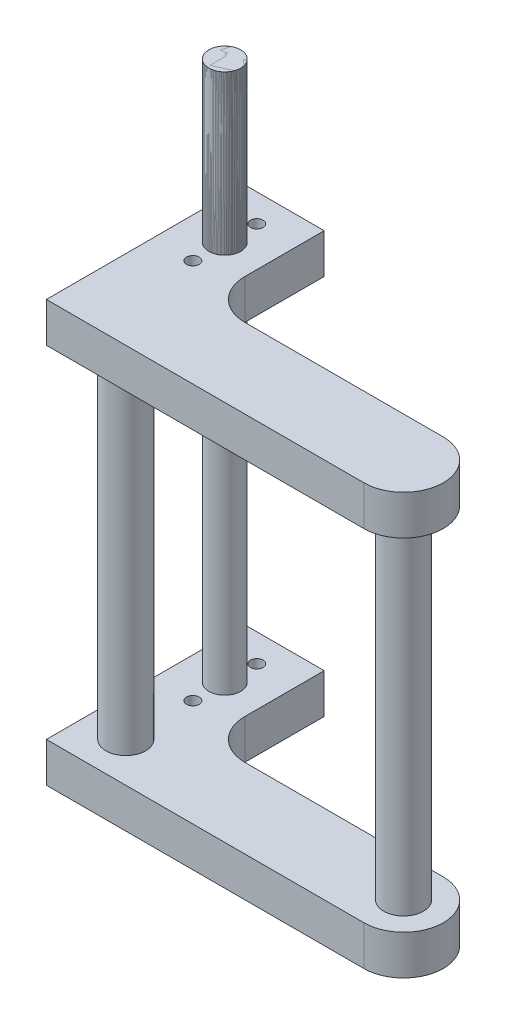
ISO-10303-21;
HEADER;
FILE_DESCRIPTION(('STEP AP214'),'2;1');
FILE_NAME('part.step','',(''),(''),'','','');
FILE_SCHEMA(('AUTOMOTIVE_DESIGN { 1 0 10303 214 1 1 1 1 }'));
ENDSEC;
DATA;
#1=APPLICATION_CONTEXT('core data for automotive mechanical design processes');
#2=APPLICATION_PROTOCOL_DEFINITION('international standard','automotive_design',2000,#1);
#3=PRODUCT_CONTEXT('',#1,'mechanical');
#4=PRODUCT('Part','Part','',(#3));
#5=PRODUCT_RELATED_PRODUCT_CATEGORY('part','',(#4));
#6=PRODUCT_DEFINITION_FORMATION('','',#4);
#7=PRODUCT_DEFINITION_CONTEXT('part definition',#1,'design');
#8=PRODUCT_DEFINITION('design','',#6,#7);
#9=PRODUCT_DEFINITION_SHAPE('','',#8);
#10=(LENGTH_UNIT() NAMED_UNIT(*) SI_UNIT(.MILLI.,.METRE.));
#11=(NAMED_UNIT(*) PLANE_ANGLE_UNIT() SI_UNIT($,.RADIAN.));
#12=(NAMED_UNIT(*) SI_UNIT($,.STERADIAN.) SOLID_ANGLE_UNIT());
#13=UNCERTAINTY_MEASURE_WITH_UNIT(LENGTH_MEASURE(1.E-05),#10,'distance_accuracy_value','');
#14=(GEOMETRIC_REPRESENTATION_CONTEXT(3) GLOBAL_UNCERTAINTY_ASSIGNED_CONTEXT((#13)) GLOBAL_UNIT_ASSIGNED_CONTEXT((#10,
#11,#12)) REPRESENTATION_CONTEXT('',''));
#15=CARTESIAN_POINT('',(0.,0.,0.));
#16=DIRECTION('',(0.,0.,1.));
#17=DIRECTION('',(1.,0.,0.));
#18=AXIS2_PLACEMENT_3D('',#15,#16,#17);
#19=CARTESIAN_POINT('',(0.,106.,0.));
#20=DIRECTION('',(0.,1.,0.));
#21=DIRECTION('',(0.,0.,1.));
#22=AXIS2_PLACEMENT_3D('',#19,#20,#21);
#23=PLANE('',#22);
#24=CARTESIAN_POINT('',(-10.,106.,-14.95));
#25=DIRECTION('',(0.,1.,0.));
#26=DIRECTION('',(0.,0.,1.));
#27=AXIS2_PLACEMENT_3D('',#24,#25,#26);
#28=CIRCLE('',#27,4.);
#29=CARTESIAN_POINT('',(-10.,106.,-10.95));
#30=VERTEX_POINT('',#29);
#31=EDGE_CURVE('E62',#30,#30,#28,.T.);
#32=ORIENTED_EDGE('',*,*,#31,.F.);
#33=EDGE_LOOP('',(#32));
#34=FACE_BOUND('',#33,.T.);
#35=ADVANCED_FACE('F58',(#34),#23,.F.);
#36=CARTESIAN_POINT('',(-10.,146.,-14.95));
#37=DIRECTION('',(0.,-1.,0.));
#38=DIRECTION('',(0.,0.,-1.));
#39=AXIS2_PLACEMENT_3D('',#36,#37,#38);
#40=CYLINDRICAL_SURFACE('',#39,4.);
#41=CARTESIAN_POINT('',(-10.,146.,-14.95));
#42=DIRECTION('',(0.,1.,0.));
#43=DIRECTION('',(0.,0.,1.));
#44=AXIS2_PLACEMENT_3D('',#41,#42,#43);
#45=CIRCLE('',#44,4.);
#46=CARTESIAN_POINT('',(-10.,146.,-10.95));
#47=VERTEX_POINT('',#46);
#48=EDGE_CURVE('E12',#47,#47,#45,.T.);
#49=ORIENTED_EDGE('',*,*,#48,.F.);
#50=EDGE_LOOP('',(#49));
#51=FACE_BOUND('',#50,.T.);
#52=ORIENTED_EDGE('',*,*,#31,.T.);
#53=EDGE_LOOP('',(#52));
#54=FACE_BOUND('',#53,.T.);
#55=ADVANCED_FACE('F60',(#51,#54),#40,.T.);
#56=CARTESIAN_POINT('',(0.,146.,0.));
#57=DIRECTION('',(0.,1.,0.));
#58=DIRECTION('',(0.,0.,1.));
#59=AXIS2_PLACEMENT_3D('',#56,#57,#58);
#60=PLANE('',#59);
#61=ORIENTED_EDGE('',*,*,#48,.T.);
#62=EDGE_LOOP('',(#61));
#63=FACE_BOUND('',#62,.T.);
#64=ADVANCED_FACE('F73',(#63),#60,.T.);
#65=CLOSED_SHELL('',(#35,#55,#64));
#66=MANIFOLD_SOLID_BREP('B2',#65);
#67=CARTESIAN_POINT('',(-10.,106.,10.));
#68=DIRECTION('',(0.,-1.,0.));
#69=DIRECTION('',(0.,0.,-1.));
#70=AXIS2_PLACEMENT_3D('',#67,#68,#69);
#71=CYLINDRICAL_SURFACE('',#70,5.);
#72=CARTESIAN_POINT('',(-10.,9.99999999999999,10.));
#73=DIRECTION('',(0.,-1.,0.));
#74=DIRECTION('',(0.,0.,-1.));
#75=AXIS2_PLACEMENT_3D('',#72,#73,#74);
#76=CIRCLE('',#75,5.);
#77=CARTESIAN_POINT('',(-10.,9.99999999999999,5.));
#78=VERTEX_POINT('',#77);
#79=EDGE_CURVE('E222',#78,#78,#76,.T.);
#80=ORIENTED_EDGE('',*,*,#79,.F.);
#81=EDGE_LOOP('',(#80));
#82=FACE_BOUND('',#81,.T.);
#83=CARTESIAN_POINT('',(-10.,96.,10.));
#84=DIRECTION('',(0.,-1.,0.));
#85=DIRECTION('',(0.,0.,-1.));
#86=AXIS2_PLACEMENT_3D('',#83,#84,#85);
#87=CIRCLE('',#86,5.);
#88=CARTESIAN_POINT('',(-10.,96.,5.));
#89=VERTEX_POINT('',#88);
#90=EDGE_CURVE('E645',#89,#89,#87,.T.);
#91=ORIENTED_EDGE('',*,*,#90,.T.);
#92=EDGE_LOOP('',(#91));
#93=FACE_BOUND('',#92,.T.);
#94=ADVANCED_FACE('F108',(#82,#93),#71,.T.);
#95=CARTESIAN_POINT('',(-10.,106.,-14.95));
#96=DIRECTION('',(0.,-1.,0.));
#97=DIRECTION('',(0.,0.,-1.));
#98=AXIS2_PLACEMENT_3D('',#95,#96,#97);
#99=CYLINDRICAL_SURFACE('',#98,4.);
#100=CARTESIAN_POINT('',(-10.,9.99999999999999,-14.95));
#101=DIRECTION('',(0.,-1.,0.));
#102=DIRECTION('',(0.,0.,-1.));
#103=AXIS2_PLACEMENT_3D('',#100,#101,#102);
#104=CIRCLE('',#103,4.);
#105=CARTESIAN_POINT('',(-10.,9.99999999999999,-18.95));
#106=VERTEX_POINT('',#105);
#107=EDGE_CURVE('E265',#106,#106,#104,.T.);
#108=ORIENTED_EDGE('',*,*,#107,.F.);
#109=EDGE_LOOP('',(#108));
#110=FACE_BOUND('',#109,.T.);
#111=CARTESIAN_POINT('',(-10.,96.,-14.95));
#112=DIRECTION('',(0.,-1.,0.));
#113=DIRECTION('',(0.,0.,-1.));
#114=AXIS2_PLACEMENT_3D('',#111,#112,#113);
#115=CIRCLE('',#114,4.);
#116=CARTESIAN_POINT('',(-10.,96.,-18.95));
#117=VERTEX_POINT('',#116);
#118=EDGE_CURVE('E642',#117,#117,#115,.T.);
#119=ORIENTED_EDGE('',*,*,#118,.T.);
#120=EDGE_LOOP('',(#119));
#121=FACE_BOUND('',#120,.T.);
#122=ADVANCED_FACE('F389',(#110,#121),#99,.T.);
#123=CARTESIAN_POINT('',(60.,106.,10.));
#124=DIRECTION('',(0.,-1.,0.));
#125=DIRECTION('',(0.,0.,-1.));
#126=AXIS2_PLACEMENT_3D('',#123,#124,#125);
#127=CYLINDRICAL_SURFACE('',#126,5.);
#128=CARTESIAN_POINT('',(60.,9.99999999999999,10.));
#129=DIRECTION('',(0.,-1.,0.));
#130=DIRECTION('',(0.,0.,-1.));
#131=AXIS2_PLACEMENT_3D('',#128,#129,#130);
#132=CIRCLE('',#131,5.);
#133=CARTESIAN_POINT('',(60.,9.99999999999999,5.));
#134=VERTEX_POINT('',#133);
#135=EDGE_CURVE('E268',#134,#134,#132,.T.);
#136=ORIENTED_EDGE('',*,*,#135,.F.);
#137=EDGE_LOOP('',(#136));
#138=FACE_BOUND('',#137,.T.);
#139=CARTESIAN_POINT('',(60.,96.,10.));
#140=DIRECTION('',(0.,-1.,0.));
#141=DIRECTION('',(0.,0.,-1.));
#142=AXIS2_PLACEMENT_3D('',#139,#140,#141);
#143=CIRCLE('',#142,5.);
#144=CARTESIAN_POINT('',(60.,96.,5.));
#145=VERTEX_POINT('',#144);
#146=EDGE_CURVE('E637',#145,#145,#143,.T.);
#147=ORIENTED_EDGE('',*,*,#146,.T.);
#148=EDGE_LOOP('',(#147));
#149=FACE_BOUND('',#148,.T.);
#150=ADVANCED_FACE('F396',(#138,#149),#127,.T.);
#151=CARTESIAN_POINT('',(60.,10.,10.));
#152=DIRECTION('',(0.,-1.,0.));
#153=DIRECTION('',(0.,0.,-1.));
#154=AXIS2_PLACEMENT_3D('',#151,#152,#153);
#155=PLANE('',#154);
#156=ORIENTED_EDGE('',*,*,#135,.T.);
#157=EDGE_LOOP('',(#156));
#158=FACE_BOUND('',#157,.T.);
#159=ORIENTED_EDGE('',*,*,#107,.T.);
#160=EDGE_LOOP('',(#159));
#161=FACE_BOUND('',#160,.T.);
#162=ORIENTED_EDGE('',*,*,#79,.T.);
#163=EDGE_LOOP('',(#162));
#164=FACE_BOUND('',#163,.T.);
#165=DIRECTION('',(-1.,0.,0.));
#166=VECTOR('',#165,1.);
#167=CARTESIAN_POINT('',(0.,10.,0.));
#168=LINE('',#167,#166);
#169=CARTESIAN_POINT('',(60.,10.,0.));
#170=VERTEX_POINT('',#169);
#171=CARTESIAN_POINT('',(10.,10.,0.));
#172=VERTEX_POINT('',#171);
#173=EDGE_CURVE('E284',#170,#172,#168,.T.);
#174=ORIENTED_EDGE('',*,*,#173,.T.);
#175=CARTESIAN_POINT('',(10.,10.,-10.));
#176=DIRECTION('',(0.,-1.,0.));
#177=DIRECTION('',(0.,0.,-1.));
#178=AXIS2_PLACEMENT_3D('',#175,#176,#177);
#179=CIRCLE('',#178,10.);
#180=CARTESIAN_POINT('',(0.,10.,-10.));
#181=VERTEX_POINT('',#180);
#182=EDGE_CURVE('E338',#172,#181,#179,.T.);
#183=ORIENTED_EDGE('',*,*,#182,.T.);
#184=DIRECTION('',(0.,0.,-1.));
#185=VECTOR('',#184,1.);
#186=CARTESIAN_POINT('',(0.,10.,0.));
#187=LINE('',#186,#185);
#188=CARTESIAN_POINT('',(0.,10.,-30.));
#189=VERTEX_POINT('',#188);
#190=EDGE_CURVE('E287',#181,#189,#187,.T.);
#191=ORIENTED_EDGE('',*,*,#190,.T.);
#192=DIRECTION('',(-1.,0.,0.));
#193=VECTOR('',#192,1.);
#194=CARTESIAN_POINT('',(0.,10.,-30.));
#195=LINE('',#194,#193);
#196=CARTESIAN_POINT('',(-20.,10.,-30.));
#197=VERTEX_POINT('',#196);
#198=EDGE_CURVE('E290',#189,#197,#195,.T.);
#199=ORIENTED_EDGE('',*,*,#198,.T.);
#200=DIRECTION('',(0.,0.,1.));
#201=VECTOR('',#200,1.);
#202=CARTESIAN_POINT('',(-20.,10.,-30.));
#203=LINE('',#202,#201);
#204=CARTESIAN_POINT('',(-20.,10.,20.));
#205=VERTEX_POINT('',#204);
#206=EDGE_CURVE('E292',#197,#205,#203,.T.);
#207=ORIENTED_EDGE('',*,*,#206,.T.);
#208=DIRECTION('',(1.,0.,0.));
#209=VECTOR('',#208,1.);
#210=CARTESIAN_POINT('',(-20.,10.,20.));
#211=LINE('',#210,#209);
#212=CARTESIAN_POINT('',(60.,10.,20.));
#213=VERTEX_POINT('',#212);
#214=EDGE_CURVE('E294',#205,#213,#211,.T.);
#215=ORIENTED_EDGE('',*,*,#214,.T.);
#216=CARTESIAN_POINT('',(60.,10.,10.));
#217=DIRECTION('',(0.,1.,0.));
#218=DIRECTION('',(0.,0.,-1.));
#219=AXIS2_PLACEMENT_3D('',#216,#217,#218);
#220=CIRCLE('',#219,10.);
#221=EDGE_CURVE('E296',#213,#170,#220,.T.);
#222=ORIENTED_EDGE('',*,*,#221,.T.);
#223=EDGE_LOOP('',(#174,#183,#191,#199,#207,#215,#222));
#224=FACE_BOUND('',#223,.T.);
#225=CARTESIAN_POINT('',(-10.,10.,-23.));
#226=DIRECTION('',(0.,1.,0.));
#227=DIRECTION('',(0.,0.,1.));
#228=AXIS2_PLACEMENT_3D('',#225,#226,#227);
#229=CIRCLE('',#228,1.6);
#230=CARTESIAN_POINT('',(-10.,10.,-21.4));
#231=VERTEX_POINT('',#230);
#232=EDGE_CURVE('E278',#231,#231,#229,.T.);
#233=ORIENTED_EDGE('',*,*,#232,.F.);
#234=EDGE_LOOP('',(#233));
#235=FACE_BOUND('',#234,.T.);
#236=CARTESIAN_POINT('',(-10.,10.,-6.9));
#237=DIRECTION('',(0.,1.,0.));
#238=DIRECTION('',(0.,0.,1.));
#239=AXIS2_PLACEMENT_3D('',#236,#237,#238);
#240=CIRCLE('',#239,1.6);
#241=CARTESIAN_POINT('',(-10.,10.,-5.29999999999999));
#242=VERTEX_POINT('',#241);
#243=EDGE_CURVE('E272',#242,#242,#240,.T.);
#244=ORIENTED_EDGE('',*,*,#243,.F.);
#245=EDGE_LOOP('',(#244));
#246=FACE_BOUND('',#245,.T.);
#247=ADVANCED_FACE('F342',(#158,#161,#164,#224,#235,#246),#155,.F.);
#248=CARTESIAN_POINT('',(60.,0.,10.));
#249=DIRECTION('',(0.,-1.,0.));
#250=DIRECTION('',(0.,0.,-1.));
#251=AXIS2_PLACEMENT_3D('',#248,#249,#250);
#252=PLANE('',#251);
#253=CARTESIAN_POINT('',(-10.,0.,-23.));
#254=DIRECTION('',(0.,1.,0.));
#255=DIRECTION('',(0.,0.,1.));
#256=AXIS2_PLACEMENT_3D('',#253,#254,#255);
#257=CIRCLE('',#256,1.6);
#258=CARTESIAN_POINT('',(-10.,0.,-21.4));
#259=VERTEX_POINT('',#258);
#260=EDGE_CURVE('E275',#259,#259,#257,.T.);
#261=ORIENTED_EDGE('',*,*,#260,.T.);
#262=EDGE_LOOP('',(#261));
#263=FACE_BOUND('',#262,.T.);
#264=DIRECTION('',(-1.,0.,0.));
#265=VECTOR('',#264,1.);
#266=CARTESIAN_POINT('',(0.,0.,0.));
#267=LINE('',#266,#265);
#268=CARTESIAN_POINT('',(60.,0.,0.));
#269=VERTEX_POINT('',#268);
#270=CARTESIAN_POINT('',(10.,0.,0.));
#271=VERTEX_POINT('',#270);
#272=EDGE_CURVE('E281',#269,#271,#267,.T.);
#273=ORIENTED_EDGE('',*,*,#272,.F.);
#274=CARTESIAN_POINT('',(60.,0.,10.));
#275=DIRECTION('',(0.,1.,0.));
#276=DIRECTION('',(0.,0.,-1.));
#277=AXIS2_PLACEMENT_3D('',#274,#275,#276);
#278=CIRCLE('',#277,10.);
#279=CARTESIAN_POINT('',(60.,0.,20.));
#280=VERTEX_POINT('',#279);
#281=EDGE_CURVE('E288',#280,#269,#278,.T.);
#282=ORIENTED_EDGE('',*,*,#281,.F.);
#283=DIRECTION('',(1.,0.,0.));
#284=VECTOR('',#283,1.);
#285=CARTESIAN_POINT('',(-20.,0.,20.));
#286=LINE('',#285,#284);
#287=CARTESIAN_POINT('',(-20.,0.,20.));
#288=VERTEX_POINT('',#287);
#289=EDGE_CURVE('E307',#288,#280,#286,.T.);
#290=ORIENTED_EDGE('',*,*,#289,.F.);
#291=DIRECTION('',(0.,0.,1.));
#292=VECTOR('',#291,1.);
#293=CARTESIAN_POINT('',(-20.,0.,-30.));
#294=LINE('',#293,#292);
#295=CARTESIAN_POINT('',(-20.,0.,-30.));
#296=VERTEX_POINT('',#295);
#297=EDGE_CURVE('E305',#296,#288,#294,.T.);
#298=ORIENTED_EDGE('',*,*,#297,.F.);
#299=DIRECTION('',(-1.,0.,0.));
#300=VECTOR('',#299,1.);
#301=CARTESIAN_POINT('',(0.,0.,-30.));
#302=LINE('',#301,#300);
#303=CARTESIAN_POINT('',(0.,0.,-30.));
#304=VERTEX_POINT('',#303);
#305=EDGE_CURVE('E303',#304,#296,#302,.T.);
#306=ORIENTED_EDGE('',*,*,#305,.F.);
#307=DIRECTION('',(0.,0.,-1.));
#308=VECTOR('',#307,1.);
#309=CARTESIAN_POINT('',(0.,0.,0.));
#310=LINE('',#309,#308);
#311=CARTESIAN_POINT('',(0.,0.,-10.));
#312=VERTEX_POINT('',#311);
#313=EDGE_CURVE('E301',#312,#304,#310,.T.);
#314=ORIENTED_EDGE('',*,*,#313,.F.);
#315=CARTESIAN_POINT('',(10.,0.,-10.));
#316=DIRECTION('',(0.,-1.,0.));
#317=DIRECTION('',(0.,0.,-1.));
#318=AXIS2_PLACEMENT_3D('',#315,#316,#317);
#319=CIRCLE('',#318,10.);
#320=EDGE_CURVE('E336',#312,#271,#319,.F.);
#321=ORIENTED_EDGE('',*,*,#320,.T.);
#322=EDGE_LOOP('',(#273,#282,#290,#298,#306,#314,#321));
#323=FACE_BOUND('',#322,.T.);
#324=CARTESIAN_POINT('',(-10.,0.,-6.9));
#325=DIRECTION('',(0.,1.,0.));
#326=DIRECTION('',(0.,0.,1.));
#327=AXIS2_PLACEMENT_3D('',#324,#325,#326);
#328=CIRCLE('',#327,1.6);
#329=CARTESIAN_POINT('',(-10.,0.,-5.29999999999999));
#330=VERTEX_POINT('',#329);
#331=EDGE_CURVE('E271',#330,#330,#328,.T.);
#332=ORIENTED_EDGE('',*,*,#331,.T.);
#333=EDGE_LOOP('',(#332));
#334=FACE_BOUND('',#333,.T.);
#335=ADVANCED_FACE('F356',(#263,#323,#334),#252,.T.);
#336=CARTESIAN_POINT('',(0.,10.,0.));
#337=DIRECTION('',(0.,0.,1.));
#338=DIRECTION('',(1.,0.,0.));
#339=AXIS2_PLACEMENT_3D('',#336,#337,#338);
#340=PLANE('',#339);
#341=ORIENTED_EDGE('',*,*,#272,.T.);
#342=DIRECTION('',(0.,-1.,0.));
#343=VECTOR('',#342,1.);
#344=CARTESIAN_POINT('',(10.,10.,0.));
#345=LINE('',#344,#343);
#346=EDGE_CURVE('E330',#271,#172,#345,.F.);
#347=ORIENTED_EDGE('',*,*,#346,.T.);
#348=ORIENTED_EDGE('',*,*,#173,.F.);
#349=DIRECTION('',(0.,-1.,0.));
#350=VECTOR('',#349,1.);
#351=CARTESIAN_POINT('',(60.,10.,0.));
#352=LINE('',#351,#350);
#353=EDGE_CURVE('E298',#170,#269,#352,.T.);
#354=ORIENTED_EDGE('',*,*,#353,.T.);
#355=EDGE_LOOP('',(#341,#347,#348,#354));
#356=FACE_BOUND('',#355,.T.);
#357=ADVANCED_FACE('F361',(#356),#340,.F.);
#358=CARTESIAN_POINT('',(0.,10.,0.));
#359=DIRECTION('',(-1.,0.,0.));
#360=DIRECTION('',(0.,0.,1.));
#361=AXIS2_PLACEMENT_3D('',#358,#359,#360);
#362=PLANE('',#361);
#363=ORIENTED_EDGE('',*,*,#190,.F.);
#364=DIRECTION('',(0.,-1.,0.));
#365=VECTOR('',#364,1.);
#366=CARTESIAN_POINT('',(0.,0.,-10.));
#367=LINE('',#366,#365);
#368=EDGE_CURVE('E327',#181,#312,#367,.T.);
#369=ORIENTED_EDGE('',*,*,#368,.T.);
#370=ORIENTED_EDGE('',*,*,#313,.T.);
#371=DIRECTION('',(0.,-1.,0.));
#372=VECTOR('',#371,1.);
#373=CARTESIAN_POINT('',(0.,10.,-30.));
#374=LINE('',#373,#372);
#375=EDGE_CURVE('E321',#189,#304,#374,.T.);
#376=ORIENTED_EDGE('',*,*,#375,.F.);
#377=EDGE_LOOP('',(#363,#369,#370,#376));
#378=FACE_BOUND('',#377,.T.);
#379=ADVANCED_FACE('F350',(#378),#362,.F.);
#380=CARTESIAN_POINT('',(0.,10.,-30.));
#381=DIRECTION('',(0.,0.,1.));
#382=DIRECTION('',(1.,0.,0.));
#383=AXIS2_PLACEMENT_3D('',#380,#381,#382);
#384=PLANE('',#383);
#385=ORIENTED_EDGE('',*,*,#305,.T.);
#386=DIRECTION('',(0.,-1.,0.));
#387=VECTOR('',#386,1.);
#388=CARTESIAN_POINT('',(-20.,10.,-30.));
#389=LINE('',#388,#387);
#390=EDGE_CURVE('E318',#197,#296,#389,.T.);
#391=ORIENTED_EDGE('',*,*,#390,.F.);
#392=ORIENTED_EDGE('',*,*,#198,.F.);
#393=ORIENTED_EDGE('',*,*,#375,.T.);
#394=EDGE_LOOP('',(#385,#391,#392,#393));
#395=FACE_BOUND('',#394,.T.);
#396=ADVANCED_FACE('F378',(#395),#384,.F.);
#397=CARTESIAN_POINT('',(-20.,10.,-30.));
#398=DIRECTION('',(1.,0.,0.));
#399=DIRECTION('',(0.,0.,-1.));
#400=AXIS2_PLACEMENT_3D('',#397,#398,#399);
#401=PLANE('',#400);
#402=ORIENTED_EDGE('',*,*,#297,.T.);
#403=DIRECTION('',(0.,-1.,0.));
#404=VECTOR('',#403,1.);
#405=CARTESIAN_POINT('',(-20.,10.,20.));
#406=LINE('',#405,#404);
#407=EDGE_CURVE('E315',#205,#288,#406,.T.);
#408=ORIENTED_EDGE('',*,*,#407,.F.);
#409=ORIENTED_EDGE('',*,*,#206,.F.);
#410=ORIENTED_EDGE('',*,*,#390,.T.);
#411=EDGE_LOOP('',(#402,#408,#409,#410));
#412=FACE_BOUND('',#411,.T.);
#413=ADVANCED_FACE('F375',(#412),#401,.F.);
#414=CARTESIAN_POINT('',(-20.,10.,20.));
#415=DIRECTION('',(0.,0.,-1.));
#416=DIRECTION('',(-1.,0.,0.));
#417=AXIS2_PLACEMENT_3D('',#414,#415,#416);
#418=PLANE('',#417);
#419=ORIENTED_EDGE('',*,*,#289,.T.);
#420=DIRECTION('',(0.,-1.,0.));
#421=VECTOR('',#420,1.);
#422=CARTESIAN_POINT('',(60.,10.,20.));
#423=LINE('',#422,#421);
#424=EDGE_CURVE('E312',#213,#280,#423,.T.);
#425=ORIENTED_EDGE('',*,*,#424,.F.);
#426=ORIENTED_EDGE('',*,*,#214,.F.);
#427=ORIENTED_EDGE('',*,*,#407,.T.);
#428=EDGE_LOOP('',(#419,#425,#426,#427));
#429=FACE_BOUND('',#428,.T.);
#430=ADVANCED_FACE('F370',(#429),#418,.F.);
#431=CARTESIAN_POINT('',(60.,10.,10.));
#432=DIRECTION('',(0.,-1.,0.));
#433=DIRECTION('',(0.,0.,-1.));
#434=AXIS2_PLACEMENT_3D('',#431,#432,#433);
#435=CYLINDRICAL_SURFACE('',#434,10.);
#436=ORIENTED_EDGE('',*,*,#281,.T.);
#437=ORIENTED_EDGE('',*,*,#353,.F.);
#438=ORIENTED_EDGE('',*,*,#221,.F.);
#439=ORIENTED_EDGE('',*,*,#424,.T.);
#440=EDGE_LOOP('',(#436,#437,#438,#439));
#441=FACE_BOUND('',#440,.T.);
#442=ADVANCED_FACE('F365',(#441),#435,.T.);
#443=CARTESIAN_POINT('',(-10.,10.,-23.));
#444=DIRECTION('',(0.,-1.,0.));
#445=DIRECTION('',(0.,0.,-1.));
#446=AXIS2_PLACEMENT_3D('',#443,#444,#445);
#447=CYLINDRICAL_SURFACE('',#446,1.6);
#448=ORIENTED_EDGE('',*,*,#232,.T.);
#449=EDGE_LOOP('',(#448));
#450=FACE_BOUND('',#449,.T.);
#451=ORIENTED_EDGE('',*,*,#260,.F.);
#452=EDGE_LOOP('',(#451));
#453=FACE_BOUND('',#452,.T.);
#454=ADVANCED_FACE('F406',(#450,#453),#447,.F.);
#455=CARTESIAN_POINT('',(-10.,10.,-6.9));
#456=DIRECTION('',(0.,-1.,0.));
#457=DIRECTION('',(0.,0.,-1.));
#458=AXIS2_PLACEMENT_3D('',#455,#456,#457);
#459=CYLINDRICAL_SURFACE('',#458,1.6);
#460=ORIENTED_EDGE('',*,*,#243,.T.);
#461=EDGE_LOOP('',(#460));
#462=FACE_BOUND('',#461,.T.);
#463=ORIENTED_EDGE('',*,*,#331,.F.);
#464=EDGE_LOOP('',(#463));
#465=FACE_BOUND('',#464,.T.);
#466=ADVANCED_FACE('F403',(#462,#465),#459,.F.);
#467=CARTESIAN_POINT('',(60.,96.,10.));
#468=DIRECTION('',(0.,1.,0.));
#469=DIRECTION('',(0.,0.,-1.));
#470=AXIS2_PLACEMENT_3D('',#467,#468,#469);
#471=PLANE('',#470);
#472=ORIENTED_EDGE('',*,*,#146,.F.);
#473=EDGE_LOOP('',(#472));
#474=FACE_BOUND('',#473,.T.);
#475=ORIENTED_EDGE('',*,*,#118,.F.);
#476=EDGE_LOOP('',(#475));
#477=FACE_BOUND('',#476,.T.);
#478=ORIENTED_EDGE('',*,*,#90,.F.);
#479=EDGE_LOOP('',(#478));
#480=FACE_BOUND('',#479,.T.);
#481=DIRECTION('',(-1.,0.,0.));
#482=VECTOR('',#481,1.);
#483=CARTESIAN_POINT('',(0.,96.,0.));
#484=LINE('',#483,#482);
#485=CARTESIAN_POINT('',(60.,96.,0.));
#486=VERTEX_POINT('',#485);
#487=CARTESIAN_POINT('',(10.,96.,0.));
#488=VERTEX_POINT('',#487);
#489=EDGE_CURVE('E214',#486,#488,#484,.T.);
#490=ORIENTED_EDGE('',*,*,#489,.F.);
#491=CARTESIAN_POINT('',(60.,96.,10.));
#492=DIRECTION('',(0.,1.,0.));
#493=DIRECTION('',(0.,0.,-1.));
#494=AXIS2_PLACEMENT_3D('',#491,#492,#493);
#495=CIRCLE('',#494,10.);
#496=CARTESIAN_POINT('',(60.,96.,20.));
#497=VERTEX_POINT('',#496);
#498=EDGE_CURVE('E238',#497,#486,#495,.T.);
#499=ORIENTED_EDGE('',*,*,#498,.F.);
#500=DIRECTION('',(1.,0.,0.));
#501=VECTOR('',#500,1.);
#502=CARTESIAN_POINT('',(-20.,96.,20.));
#503=LINE('',#502,#501);
#504=CARTESIAN_POINT('',(-20.,96.,20.));
#505=VERTEX_POINT('',#504);
#506=EDGE_CURVE('E232',#505,#497,#503,.T.);
#507=ORIENTED_EDGE('',*,*,#506,.F.);
#508=DIRECTION('',(0.,0.,1.));
#509=VECTOR('',#508,1.);
#510=CARTESIAN_POINT('',(-20.,96.,-30.));
#511=LINE('',#510,#509);
#512=CARTESIAN_POINT('',(-20.,96.,-30.));
#513=VERTEX_POINT('',#512);
#514=EDGE_CURVE('E230',#513,#505,#511,.T.);
#515=ORIENTED_EDGE('',*,*,#514,.F.);
#516=DIRECTION('',(-1.,0.,0.));
#517=VECTOR('',#516,1.);
#518=CARTESIAN_POINT('',(0.,96.,-30.));
#519=LINE('',#518,#517);
#520=CARTESIAN_POINT('',(0.,96.,-30.));
#521=VERTEX_POINT('',#520);
#522=EDGE_CURVE('E213',#521,#513,#519,.T.);
#523=ORIENTED_EDGE('',*,*,#522,.F.);
#524=DIRECTION('',(0.,0.,-1.));
#525=VECTOR('',#524,1.);
#526=CARTESIAN_POINT('',(0.,96.,0.));
#527=LINE('',#526,#525);
#528=CARTESIAN_POINT('',(0.,96.,-10.));
#529=VERTEX_POINT('',#528);
#530=EDGE_CURVE('E205',#529,#521,#527,.T.);
#531=ORIENTED_EDGE('',*,*,#530,.F.);
#532=CARTESIAN_POINT('',(10.,96.,-10.));
#533=DIRECTION('',(0.,1.,0.));
#534=DIRECTION('',(0.,0.,1.));
#535=AXIS2_PLACEMENT_3D('',#532,#533,#534);
#536=CIRCLE('',#535,10.);
#537=EDGE_CURVE('E56',#529,#488,#536,.T.);
#538=ORIENTED_EDGE('',*,*,#537,.T.);
#539=EDGE_LOOP('',(#490,#499,#507,#515,#523,#531,#538));
#540=FACE_BOUND('',#539,.T.);
#541=CARTESIAN_POINT('',(-10.,96.,-23.));
#542=DIRECTION('',(0.,1.,0.));
#543=DIRECTION('',(0.,0.,1.));
#544=AXIS2_PLACEMENT_3D('',#541,#542,#543);
#545=CIRCLE('',#544,1.6);
#546=CARTESIAN_POINT('',(-10.,96.,-21.4));
#547=VERTEX_POINT('',#546);
#548=EDGE_CURVE('E245',#547,#547,#545,.T.);
#549=ORIENTED_EDGE('',*,*,#548,.T.);
#550=EDGE_LOOP('',(#549));
#551=FACE_BOUND('',#550,.T.);
#552=CARTESIAN_POINT('',(-10.,96.,-6.9));
#553=DIRECTION('',(0.,1.,0.));
#554=DIRECTION('',(0.,0.,1.));
#555=AXIS2_PLACEMENT_3D('',#552,#553,#554);
#556=CIRCLE('',#555,1.6);
#557=CARTESIAN_POINT('',(-10.,96.,-5.29999999999999));
#558=VERTEX_POINT('',#557);
#559=EDGE_CURVE('E631',#558,#558,#556,.T.);
#560=ORIENTED_EDGE('',*,*,#559,.T.);
#561=EDGE_LOOP('',(#560));
#562=FACE_BOUND('',#561,.T.);
#563=ADVANCED_FACE('F226',(#474,#477,#480,#540,#551,#562),#471,.F.);
#564=CARTESIAN_POINT('',(0.,96.,0.));
#565=DIRECTION('',(0.,0.,1.));
#566=DIRECTION('',(1.,0.,0.));
#567=AXIS2_PLACEMENT_3D('',#564,#565,#566);
#568=PLANE('',#567);
#569=ORIENTED_EDGE('',*,*,#489,.T.);
#570=DIRECTION('',(0.,1.,0.));
#571=VECTOR('',#570,1.);
#572=CARTESIAN_POINT('',(10.,106.,0.));
#573=LINE('',#572,#571);
#574=CARTESIAN_POINT('',(10.,106.,0.));
#575=VERTEX_POINT('',#574);
#576=EDGE_CURVE('E332',#488,#575,#573,.T.);
#577=ORIENTED_EDGE('',*,*,#576,.T.);
#578=DIRECTION('',(-1.,0.,0.));
#579=VECTOR('',#578,1.);
#580=CARTESIAN_POINT('',(0.,106.,0.));
#581=LINE('',#580,#579);
#582=CARTESIAN_POINT('',(60.,106.,0.));
#583=VERTEX_POINT('',#582);
#584=EDGE_CURVE('E242',#583,#575,#581,.T.);
#585=ORIENTED_EDGE('',*,*,#584,.F.);
#586=DIRECTION('',(0.,1.,0.));
#587=VECTOR('',#586,1.);
#588=CARTESIAN_POINT('',(60.,96.,0.));
#589=LINE('',#588,#587);
#590=EDGE_CURVE('E241',#486,#583,#589,.T.);
#591=ORIENTED_EDGE('',*,*,#590,.F.);
#592=EDGE_LOOP('',(#569,#577,#585,#591));
#593=FACE_BOUND('',#592,.T.);
#594=ADVANCED_FACE('F506',(#593),#568,.F.);
#595=CARTESIAN_POINT('',(0.,96.,0.));
#596=DIRECTION('',(-1.,0.,0.));
#597=DIRECTION('',(0.,0.,1.));
#598=AXIS2_PLACEMENT_3D('',#595,#596,#597);
#599=PLANE('',#598);
#600=DIRECTION('',(0.,0.,-1.));
#601=VECTOR('',#600,1.);
#602=CARTESIAN_POINT('',(0.,106.,0.));
#603=LINE('',#602,#601);
#604=CARTESIAN_POINT('',(0.,106.,-10.));
#605=VERTEX_POINT('',#604);
#606=CARTESIAN_POINT('',(0.,106.,-30.));
#607=VERTEX_POINT('',#606);
#608=EDGE_CURVE('E244',#605,#607,#603,.T.);
#609=ORIENTED_EDGE('',*,*,#608,.F.);
#610=DIRECTION('',(0.,1.,0.));
#611=VECTOR('',#610,1.);
#612=CARTESIAN_POINT('',(0.,96.,-10.));
#613=LINE('',#612,#611);
#614=EDGE_CURVE('E123',#605,#529,#613,.F.);
#615=ORIENTED_EDGE('',*,*,#614,.T.);
#616=ORIENTED_EDGE('',*,*,#530,.T.);
#617=DIRECTION('',(0.,1.,0.));
#618=VECTOR('',#617,1.);
#619=CARTESIAN_POINT('',(0.,96.,-30.));
#620=LINE('',#619,#618);
#621=EDGE_CURVE('E208',#521,#607,#620,.T.);
#622=ORIENTED_EDGE('',*,*,#621,.T.);
#623=EDGE_LOOP('',(#609,#615,#616,#622));
#624=FACE_BOUND('',#623,.T.);
#625=ADVANCED_FACE('F207',(#624),#599,.F.);
#626=CARTESIAN_POINT('',(0.,96.,-30.));
#627=DIRECTION('',(0.,0.,1.));
#628=DIRECTION('',(1.,0.,0.));
#629=AXIS2_PLACEMENT_3D('',#626,#627,#628);
#630=PLANE('',#629);
#631=DIRECTION('',(-1.,0.,0.));
#632=VECTOR('',#631,1.);
#633=CARTESIAN_POINT('',(0.,106.,-30.));
#634=LINE('',#633,#632);
#635=CARTESIAN_POINT('',(-20.,106.,-30.));
#636=VERTEX_POINT('',#635);
#637=EDGE_CURVE('E221',#607,#636,#634,.T.);
#638=ORIENTED_EDGE('',*,*,#637,.F.);
#639=ORIENTED_EDGE('',*,*,#621,.F.);
#640=ORIENTED_EDGE('',*,*,#522,.T.);
#641=DIRECTION('',(0.,1.,0.));
#642=VECTOR('',#641,1.);
#643=CARTESIAN_POINT('',(-20.,96.,-30.));
#644=LINE('',#643,#642);
#645=EDGE_CURVE('E223',#513,#636,#644,.T.);
#646=ORIENTED_EDGE('',*,*,#645,.T.);
#647=EDGE_LOOP('',(#638,#639,#640,#646));
#648=FACE_BOUND('',#647,.T.);
#649=ADVANCED_FACE('F218',(#648),#630,.F.);
#650=CARTESIAN_POINT('',(-20.,96.,-30.));
#651=DIRECTION('',(1.,0.,0.));
#652=DIRECTION('',(0.,0.,-1.));
#653=AXIS2_PLACEMENT_3D('',#650,#651,#652);
#654=PLANE('',#653);
#655=DIRECTION('',(0.,0.,1.));
#656=VECTOR('',#655,1.);
#657=CARTESIAN_POINT('',(-20.,106.,-30.));
#658=LINE('',#657,#656);
#659=CARTESIAN_POINT('',(-20.,106.,20.));
#660=VERTEX_POINT('',#659);
#661=EDGE_CURVE('E248',#636,#660,#658,.T.);
#662=ORIENTED_EDGE('',*,*,#661,.F.);
#663=ORIENTED_EDGE('',*,*,#645,.F.);
#664=ORIENTED_EDGE('',*,*,#514,.T.);
#665=DIRECTION('',(0.,1.,0.));
#666=VECTOR('',#665,1.);
#667=CARTESIAN_POINT('',(-20.,96.,20.));
#668=LINE('',#667,#666);
#669=EDGE_CURVE('E260',#505,#660,#668,.T.);
#670=ORIENTED_EDGE('',*,*,#669,.T.);
#671=EDGE_LOOP('',(#662,#663,#664,#670));
#672=FACE_BOUND('',#671,.T.);
#673=ADVANCED_FACE('F529',(#672),#654,.F.);
#674=CARTESIAN_POINT('',(-20.,96.,20.));
#675=DIRECTION('',(0.,0.,-1.));
#676=DIRECTION('',(-1.,0.,0.));
#677=AXIS2_PLACEMENT_3D('',#674,#675,#676);
#678=PLANE('',#677);
#679=DIRECTION('',(1.,0.,0.));
#680=VECTOR('',#679,1.);
#681=CARTESIAN_POINT('',(-20.,106.,20.));
#682=LINE('',#681,#680);
#683=CARTESIAN_POINT('',(60.,106.,20.));
#684=VERTEX_POINT('',#683);
#685=EDGE_CURVE('E251',#660,#684,#682,.T.);
#686=ORIENTED_EDGE('',*,*,#685,.F.);
#687=ORIENTED_EDGE('',*,*,#669,.F.);
#688=ORIENTED_EDGE('',*,*,#506,.T.);
#689=DIRECTION('',(0.,1.,0.));
#690=VECTOR('',#689,1.);
#691=CARTESIAN_POINT('',(60.,96.,20.));
#692=LINE('',#691,#690);
#693=EDGE_CURVE('E258',#497,#684,#692,.T.);
#694=ORIENTED_EDGE('',*,*,#693,.T.);
#695=EDGE_LOOP('',(#686,#687,#688,#694));
#696=FACE_BOUND('',#695,.T.);
#697=ADVANCED_FACE('F537',(#696),#678,.F.);
#698=CARTESIAN_POINT('',(60.,96.,10.));
#699=DIRECTION('',(0.,1.,0.));
#700=DIRECTION('',(0.,0.,-1.));
#701=AXIS2_PLACEMENT_3D('',#698,#699,#700);
#702=CYLINDRICAL_SURFACE('',#701,10.);
#703=CARTESIAN_POINT('',(60.,106.,10.));
#704=DIRECTION('',(0.,1.,0.));
#705=DIRECTION('',(0.,0.,-1.));
#706=AXIS2_PLACEMENT_3D('',#703,#704,#705);
#707=CIRCLE('',#706,10.);
#708=EDGE_CURVE('E254',#684,#583,#707,.T.);
#709=ORIENTED_EDGE('',*,*,#708,.F.);
#710=ORIENTED_EDGE('',*,*,#693,.F.);
#711=ORIENTED_EDGE('',*,*,#498,.T.);
#712=ORIENTED_EDGE('',*,*,#590,.T.);
#713=EDGE_LOOP('',(#709,#710,#711,#712));
#714=FACE_BOUND('',#713,.T.);
#715=ADVANCED_FACE('F546',(#714),#702,.T.);
#716=CARTESIAN_POINT('',(-10.,96.,-23.));
#717=DIRECTION('',(0.,1.,0.));
#718=DIRECTION('',(0.,0.,-1.));
#719=AXIS2_PLACEMENT_3D('',#716,#717,#718);
#720=CYLINDRICAL_SURFACE('',#719,1.6);
#721=ORIENTED_EDGE('',*,*,#548,.F.);
#722=EDGE_LOOP('',(#721));
#723=FACE_BOUND('',#722,.T.);
#724=CARTESIAN_POINT('',(-10.,106.,-23.));
#725=DIRECTION('',(0.,1.,0.));
#726=DIRECTION('',(0.,0.,1.));
#727=AXIS2_PLACEMENT_3D('',#724,#725,#726);
#728=CIRCLE('',#727,1.6);
#729=CARTESIAN_POINT('',(-10.,106.,-21.4));
#730=VERTEX_POINT('',#729);
#731=EDGE_CURVE('E628',#730,#730,#728,.T.);
#732=ORIENTED_EDGE('',*,*,#731,.T.);
#733=EDGE_LOOP('',(#732));
#734=FACE_BOUND('',#733,.T.);
#735=ADVANCED_FACE('F555',(#723,#734),#720,.F.);
#736=CARTESIAN_POINT('',(-10.,96.,-6.9));
#737=DIRECTION('',(0.,1.,0.));
#738=DIRECTION('',(0.,0.,-1.));
#739=AXIS2_PLACEMENT_3D('',#736,#737,#738);
#740=CYLINDRICAL_SURFACE('',#739,1.6);
#741=ORIENTED_EDGE('',*,*,#559,.F.);
#742=EDGE_LOOP('',(#741));
#743=FACE_BOUND('',#742,.T.);
#744=CARTESIAN_POINT('',(-10.,106.,-6.9));
#745=DIRECTION('',(0.,1.,0.));
#746=DIRECTION('',(0.,0.,1.));
#747=AXIS2_PLACEMENT_3D('',#744,#745,#746);
#748=CIRCLE('',#747,1.6);
#749=CARTESIAN_POINT('',(-10.,106.,-5.29999999999999));
#750=VERTEX_POINT('',#749);
#751=EDGE_CURVE('E634',#750,#750,#748,.T.);
#752=ORIENTED_EDGE('',*,*,#751,.T.);
#753=EDGE_LOOP('',(#752));
#754=FACE_BOUND('',#753,.T.);
#755=ADVANCED_FACE('F455',(#743,#754),#740,.F.);
#756=CARTESIAN_POINT('',(60.,106.,10.));
#757=DIRECTION('',(0.,-1.,0.));
#758=DIRECTION('',(0.,0.,-1.));
#759=AXIS2_PLACEMENT_3D('',#756,#757,#758);
#760=PLANE('',#759);
#761=CARTESIAN_POINT('',(-10.,106.,-14.95));
#762=DIRECTION('',(0.,-1.,0.));
#763=DIRECTION('',(0.,0.,-1.));
#764=AXIS2_PLACEMENT_3D('',#761,#762,#763);
#765=CIRCLE('',#764,4.);
#766=CARTESIAN_POINT('',(-10.,106.,-18.95));
#767=VERTEX_POINT('',#766);
#768=EDGE_CURVE('E324',#767,#767,#765,.F.);
#769=ORIENTED_EDGE('',*,*,#768,.F.);
#770=EDGE_LOOP('',(#769));
#771=FACE_BOUND('',#770,.T.);
#772=ORIENTED_EDGE('',*,*,#731,.F.);
#773=EDGE_LOOP('',(#772));
#774=FACE_BOUND('',#773,.T.);
#775=ORIENTED_EDGE('',*,*,#584,.T.);
#776=CARTESIAN_POINT('',(10.,106.,-10.));
#777=DIRECTION('',(0.,-1.,0.));
#778=DIRECTION('',(0.,0.,-1.));
#779=AXIS2_PLACEMENT_3D('',#776,#777,#778);
#780=CIRCLE('',#779,10.);
#781=EDGE_CURVE('E116',#575,#605,#780,.T.);
#782=ORIENTED_EDGE('',*,*,#781,.T.);
#783=ORIENTED_EDGE('',*,*,#608,.T.);
#784=ORIENTED_EDGE('',*,*,#637,.T.);
#785=ORIENTED_EDGE('',*,*,#661,.T.);
#786=ORIENTED_EDGE('',*,*,#685,.T.);
#787=ORIENTED_EDGE('',*,*,#708,.T.);
#788=EDGE_LOOP('',(#775,#782,#783,#784,#785,#786,#787));
#789=FACE_BOUND('',#788,.T.);
#790=ORIENTED_EDGE('',*,*,#751,.F.);
#791=EDGE_LOOP('',(#790));
#792=FACE_BOUND('',#791,.T.);
#793=ADVANCED_FACE('F450',(#771,#774,#789,#792),#760,.F.);
#794=CARTESIAN_POINT('',(-10.,146.,-14.95));
#795=DIRECTION('',(0.,-1.,0.));
#796=DIRECTION('',(0.,0.,-1.));
#797=AXIS2_PLACEMENT_3D('',#794,#795,#796);
#798=CYLINDRICAL_SURFACE('',#797,4.);
#799=CARTESIAN_POINT('',(-10.,146.,-14.95));
#800=DIRECTION('',(0.,1.,0.));
#801=DIRECTION('',(0.,0.,1.));
#802=AXIS2_PLACEMENT_3D('',#799,#800,#801);
#803=CIRCLE('',#802,4.);
#804=CARTESIAN_POINT('',(-10.,146.,-10.95));
#805=VERTEX_POINT('',#804);
#806=EDGE_CURVE('E648',#805,#805,#803,.T.);
#807=ORIENTED_EDGE('',*,*,#806,.F.);
#808=EDGE_LOOP('',(#807));
#809=FACE_BOUND('',#808,.T.);
#810=ORIENTED_EDGE('',*,*,#768,.T.);
#811=EDGE_LOOP('',(#810));
#812=FACE_BOUND('',#811,.T.);
#813=ADVANCED_FACE('F454',(#809,#812),#798,.T.);
#814=CARTESIAN_POINT('',(-10.,146.,-14.95));
#815=DIRECTION('',(0.,1.,0.));
#816=DIRECTION('',(0.,0.,1.));
#817=AXIS2_PLACEMENT_3D('',#814,#815,#816);
#818=PLANE('',#817);
#819=ORIENTED_EDGE('',*,*,#806,.T.);
#820=EDGE_LOOP('',(#819));
#821=FACE_BOUND('',#820,.T.);
#822=ADVANCED_FACE('F581',(#821),#818,.T.);
#823=CARTESIAN_POINT('',(10.,10.,-10.));
#824=DIRECTION('',(0.,1.,0.));
#825=DIRECTION('',(0.,0.,1.));
#826=AXIS2_PLACEMENT_3D('',#823,#824,#825);
#827=CYLINDRICAL_SURFACE('',#826,10.);
#828=ORIENTED_EDGE('',*,*,#182,.F.);
#829=ORIENTED_EDGE('',*,*,#346,.F.);
#830=ORIENTED_EDGE('',*,*,#320,.F.);
#831=ORIENTED_EDGE('',*,*,#368,.F.);
#832=EDGE_LOOP('',(#828,#829,#830,#831));
#833=FACE_BOUND('',#832,.T.);
#834=ADVANCED_FACE('F353',(#833),#827,.F.);
#835=CARTESIAN_POINT('',(10.,96.,-10.));
#836=DIRECTION('',(0.,-1.,0.));
#837=DIRECTION('',(0.,0.,-1.));
#838=AXIS2_PLACEMENT_3D('',#835,#836,#837);
#839=CYLINDRICAL_SURFACE('',#838,10.);
#840=ORIENTED_EDGE('',*,*,#537,.F.);
#841=ORIENTED_EDGE('',*,*,#614,.F.);
#842=ORIENTED_EDGE('',*,*,#781,.F.);
#843=ORIENTED_EDGE('',*,*,#576,.F.);
#844=EDGE_LOOP('',(#840,#841,#842,#843));
#845=FACE_BOUND('',#844,.T.);
#846=ADVANCED_FACE('F110',(#845),#839,.F.);
#847=CLOSED_SHELL('',(#94,#122,#150,#247,#335,#357,#379,#396,#413,#430,#442,#454,#466,#563,#594,
#625,#649,#673,#697,#715,#735,#755,#793,#813,#822,#834,#846));
#848=MANIFOLD_SOLID_BREP('B7',#847);
#849=ADVANCED_BREP_SHAPE_REPRESENTATION('',(#18,#66,#848),#14);
#850=SHAPE_DEFINITION_REPRESENTATION(#9,#849);
ENDSEC;
END-ISO-10303-21;
